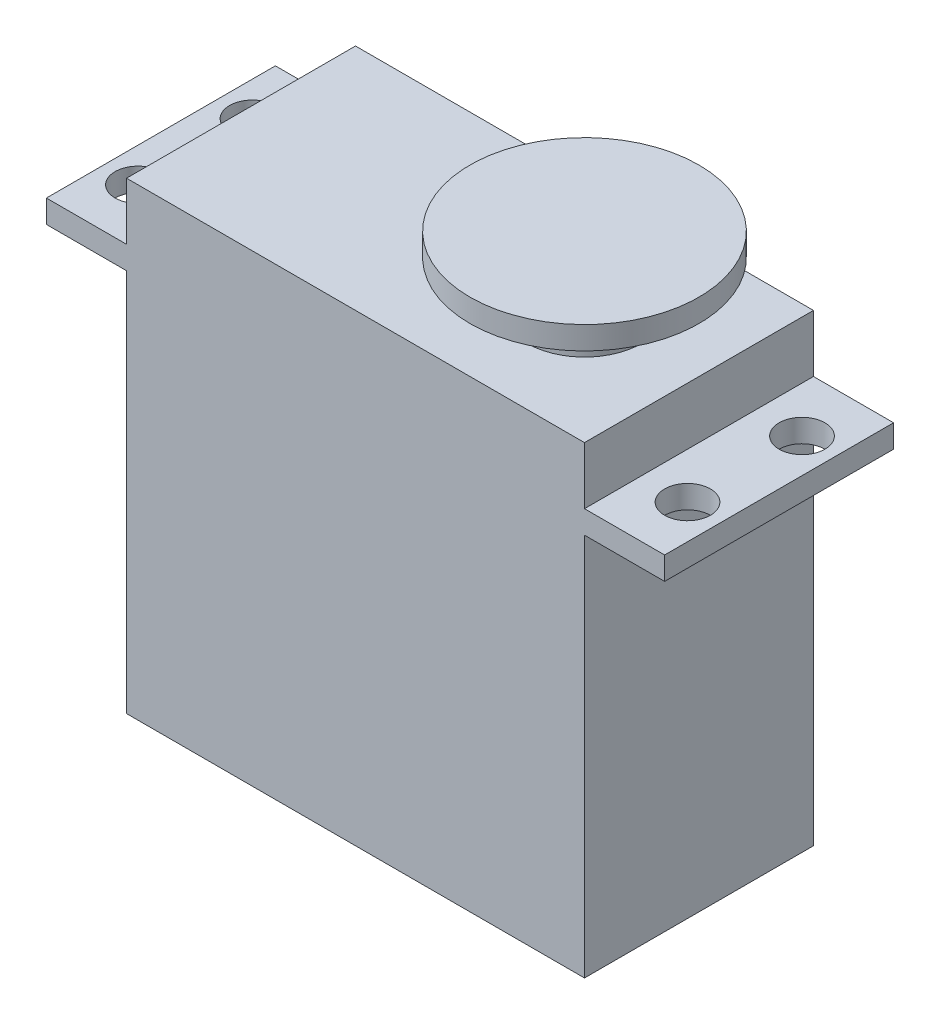
ISO-10303-21;
HEADER;
FILE_DESCRIPTION(('STEP AP214'),'2;1');
FILE_NAME('part.step','',(''),(''),'','','');
FILE_SCHEMA(('AUTOMOTIVE_DESIGN { 1 0 10303 214 1 1 1 1 }'));
ENDSEC;
DATA;
#1=APPLICATION_CONTEXT('core data for automotive mechanical design processes');
#2=APPLICATION_PROTOCOL_DEFINITION('international standard','automotive_design',2000,#1);
#3=PRODUCT_CONTEXT('',#1,'mechanical');
#4=PRODUCT('Part','Part','',(#3));
#5=PRODUCT_RELATED_PRODUCT_CATEGORY('part','',(#4));
#6=PRODUCT_DEFINITION_FORMATION('','',#4);
#7=PRODUCT_DEFINITION_CONTEXT('part definition',#1,'design');
#8=PRODUCT_DEFINITION('design','',#6,#7);
#9=PRODUCT_DEFINITION_SHAPE('','',#8);
#10=(LENGTH_UNIT() NAMED_UNIT(*) SI_UNIT(.MILLI.,.METRE.));
#11=(NAMED_UNIT(*) PLANE_ANGLE_UNIT() SI_UNIT($,.RADIAN.));
#12=(NAMED_UNIT(*) SI_UNIT($,.STERADIAN.) SOLID_ANGLE_UNIT());
#13=UNCERTAINTY_MEASURE_WITH_UNIT(LENGTH_MEASURE(1.E-05),#10,'distance_accuracy_value','');
#14=(GEOMETRIC_REPRESENTATION_CONTEXT(3) GLOBAL_UNCERTAINTY_ASSIGNED_CONTEXT((#13)) GLOBAL_UNIT_ASSIGNED_CONTEXT((#10,
#11,#12)) REPRESENTATION_CONTEXT('',''));
#15=CARTESIAN_POINT('',(0.,0.,0.));
#16=DIRECTION('',(0.,0.,1.));
#17=DIRECTION('',(1.,0.,0.));
#18=AXIS2_PLACEMENT_3D('',#15,#16,#17);
#19=CARTESIAN_POINT('',(47.,33.5,20.));
#20=DIRECTION('',(0.,-1.,0.));
#21=DIRECTION('',(0.,0.,-1.));
#22=AXIS2_PLACEMENT_3D('',#19,#20,#21);
#23=PLANE('',#22);
#24=CARTESIAN_POINT('',(44.,33.5,15.));
#25=DIRECTION('',(0.,1.,0.));
#26=DIRECTION('',(0.,0.,1.));
#27=AXIS2_PLACEMENT_3D('',#24,#25,#26);
#28=CIRCLE('',#27,2.);
#29=CARTESIAN_POINT('',(44.,33.5,17.));
#30=VERTEX_POINT('',#29);
#31=EDGE_CURVE('E159',#30,#30,#28,.T.);
#32=ORIENTED_EDGE('',*,*,#31,.T.);
#33=EDGE_LOOP('',(#32));
#34=FACE_BOUND('',#33,.T.);
#35=DIRECTION('',(0.,0.,1.));
#36=VECTOR('',#35,1.);
#37=CARTESIAN_POINT('',(40.,33.5,20.));
#38=LINE('',#37,#36);
#39=CARTESIAN_POINT('',(40.,33.5,0.));
#40=VERTEX_POINT('',#39);
#41=CARTESIAN_POINT('',(40.,33.5,20.));
#42=VERTEX_POINT('',#41);
#43=EDGE_CURVE('E157',#40,#42,#38,.T.);
#44=ORIENTED_EDGE('',*,*,#43,.F.);
#45=DIRECTION('',(-1.,0.,0.));
#46=VECTOR('',#45,1.);
#47=CARTESIAN_POINT('',(47.,33.5,0.));
#48=LINE('',#47,#46);
#49=CARTESIAN_POINT('',(47.,33.5,0.));
#50=VERTEX_POINT('',#49);
#51=EDGE_CURVE('E132',#50,#40,#48,.T.);
#52=ORIENTED_EDGE('',*,*,#51,.F.);
#53=DIRECTION('',(0.,0.,1.));
#54=VECTOR('',#53,1.);
#55=CARTESIAN_POINT('',(47.,33.5,20.));
#56=LINE('',#55,#54);
#57=CARTESIAN_POINT('',(47.,33.5,20.));
#58=VERTEX_POINT('',#57);
#59=EDGE_CURVE('E138',#50,#58,#56,.T.);
#60=ORIENTED_EDGE('',*,*,#59,.T.);
#61=DIRECTION('',(-1.,0.,0.));
#62=VECTOR('',#61,1.);
#63=CARTESIAN_POINT('',(47.,33.5,20.));
#64=LINE('',#63,#62);
#65=EDGE_CURVE('E49',#58,#42,#64,.T.);
#66=ORIENTED_EDGE('',*,*,#65,.T.);
#67=EDGE_LOOP('',(#44,#52,#60,#66));
#68=FACE_BOUND('',#67,.T.);
#69=CARTESIAN_POINT('',(44.,33.5,5.));
#70=DIRECTION('',(0.,1.,0.));
#71=DIRECTION('',(0.,0.,1.));
#72=AXIS2_PLACEMENT_3D('',#69,#70,#71);
#73=CIRCLE('',#72,2.);
#74=CARTESIAN_POINT('',(44.,33.5,7.));
#75=VERTEX_POINT('',#74);
#76=EDGE_CURVE('E536',#75,#75,#73,.T.);
#77=ORIENTED_EDGE('',*,*,#76,.T.);
#78=EDGE_LOOP('',(#77));
#79=FACE_BOUND('',#78,.T.);
#80=ADVANCED_FACE('F32',(#34,#68,#79),#23,.T.);
#81=CARTESIAN_POINT('',(47.,35.5,20.));
#82=DIRECTION('',(0.,1.,0.));
#83=DIRECTION('',(0.,0.,1.));
#84=AXIS2_PLACEMENT_3D('',#81,#82,#83);
#85=PLANE('',#84);
#86=CARTESIAN_POINT('',(44.,35.5,15.));
#87=DIRECTION('',(0.,-1.,0.));
#88=DIRECTION('',(0.,0.,1.));
#89=AXIS2_PLACEMENT_3D('',#86,#87,#88);
#90=CIRCLE('',#89,2.);
#91=CARTESIAN_POINT('',(44.,35.5,17.));
#92=VERTEX_POINT('',#91);
#93=EDGE_CURVE('E541',#92,#92,#90,.T.);
#94=ORIENTED_EDGE('',*,*,#93,.T.);
#95=EDGE_LOOP('',(#94));
#96=FACE_BOUND('',#95,.T.);
#97=DIRECTION('',(0.,0.,-1.));
#98=VECTOR('',#97,1.);
#99=CARTESIAN_POINT('',(40.,35.5,20.));
#100=LINE('',#99,#98);
#101=CARTESIAN_POINT('',(40.,35.5,20.));
#102=VERTEX_POINT('',#101);
#103=CARTESIAN_POINT('',(40.,35.5,0.));
#104=VERTEX_POINT('',#103);
#105=EDGE_CURVE('E142',#102,#104,#100,.T.);
#106=ORIENTED_EDGE('',*,*,#105,.F.);
#107=DIRECTION('',(-1.,0.,0.));
#108=VECTOR('',#107,1.);
#109=CARTESIAN_POINT('',(47.,35.5,20.));
#110=LINE('',#109,#108);
#111=CARTESIAN_POINT('',(47.,35.5,20.));
#112=VERTEX_POINT('',#111);
#113=EDGE_CURVE('E151',#112,#102,#110,.T.);
#114=ORIENTED_EDGE('',*,*,#113,.F.);
#115=DIRECTION('',(0.,0.,-1.));
#116=VECTOR('',#115,1.);
#117=CARTESIAN_POINT('',(47.,35.5,20.));
#118=LINE('',#117,#116);
#119=CARTESIAN_POINT('',(47.,35.5,0.));
#120=VERTEX_POINT('',#119);
#121=EDGE_CURVE('E141',#112,#120,#118,.T.);
#122=ORIENTED_EDGE('',*,*,#121,.T.);
#123=DIRECTION('',(-1.,0.,0.));
#124=VECTOR('',#123,1.);
#125=CARTESIAN_POINT('',(47.,35.5,0.));
#126=LINE('',#125,#124);
#127=EDGE_CURVE('E167',#120,#104,#126,.T.);
#128=ORIENTED_EDGE('',*,*,#127,.T.);
#129=EDGE_LOOP('',(#106,#114,#122,#128));
#130=FACE_BOUND('',#129,.T.);
#131=CARTESIAN_POINT('',(44.,35.5,5.));
#132=DIRECTION('',(0.,-1.,0.));
#133=DIRECTION('',(0.,0.,1.));
#134=AXIS2_PLACEMENT_3D('',#131,#132,#133);
#135=CIRCLE('',#134,2.);
#136=CARTESIAN_POINT('',(44.,35.5,7.));
#137=VERTEX_POINT('',#136);
#138=EDGE_CURVE('E539',#137,#137,#135,.T.);
#139=ORIENTED_EDGE('',*,*,#138,.T.);
#140=EDGE_LOOP('',(#139));
#141=FACE_BOUND('',#140,.T.);
#142=ADVANCED_FACE('F178',(#96,#130,#141),#85,.T.);
#143=CARTESIAN_POINT('',(40.,0.,20.));
#144=DIRECTION('',(-1.,0.,0.));
#145=DIRECTION('',(0.,0.,1.));
#146=AXIS2_PLACEMENT_3D('',#143,#144,#145);
#147=PLANE('',#146);
#148=DIRECTION('',(0.,1.,0.));
#149=VECTOR('',#148,1.);
#150=CARTESIAN_POINT('',(40.,0.,20.));
#151=LINE('',#150,#149);
#152=CARTESIAN_POINT('',(40.,40.5,20.));
#153=VERTEX_POINT('',#152);
#154=EDGE_CURVE('E160',#102,#153,#151,.T.);
#155=ORIENTED_EDGE('',*,*,#154,.F.);
#156=ORIENTED_EDGE('',*,*,#105,.T.);
#157=DIRECTION('',(0.,1.,0.));
#158=VECTOR('',#157,1.);
#159=CARTESIAN_POINT('',(40.,0.,0.));
#160=LINE('',#159,#158);
#161=CARTESIAN_POINT('',(40.,40.5,0.));
#162=VERTEX_POINT('',#161);
#163=EDGE_CURVE('E201',#104,#162,#160,.T.);
#164=ORIENTED_EDGE('',*,*,#163,.T.);
#165=DIRECTION('',(0.,0.,-1.));
#166=VECTOR('',#165,1.);
#167=CARTESIAN_POINT('',(40.,40.5,20.));
#168=LINE('',#167,#166);
#169=EDGE_CURVE('E184',#153,#162,#168,.T.);
#170=ORIENTED_EDGE('',*,*,#169,.F.);
#171=EDGE_LOOP('',(#155,#156,#164,#170));
#172=FACE_BOUND('',#171,.T.);
#173=ADVANCED_FACE('F182',(#172),#147,.F.);
#174=CARTESIAN_POINT('',(0.,0.,20.));
#175=DIRECTION('',(1.,0.,0.));
#176=DIRECTION('',(0.,0.,-1.));
#177=AXIS2_PLACEMENT_3D('',#174,#175,#176);
#178=PLANE('',#177);
#179=DIRECTION('',(0.,0.,1.));
#180=VECTOR('',#179,1.);
#181=CARTESIAN_POINT('',(0.,33.5,20.));
#182=LINE('',#181,#180);
#183=CARTESIAN_POINT('',(0.,33.5,0.));
#184=VERTEX_POINT('',#183);
#185=CARTESIAN_POINT('',(0.,33.5,20.));
#186=VERTEX_POINT('',#185);
#187=EDGE_CURVE('E231',#184,#186,#182,.T.);
#188=ORIENTED_EDGE('',*,*,#187,.F.);
#189=DIRECTION('',(0.,-1.,0.));
#190=VECTOR('',#189,1.);
#191=CARTESIAN_POINT('',(0.,0.,0.));
#192=LINE('',#191,#190);
#193=CARTESIAN_POINT('',(0.,0.,0.));
#194=VERTEX_POINT('',#193);
#195=EDGE_CURVE('E221',#184,#194,#192,.T.);
#196=ORIENTED_EDGE('',*,*,#195,.T.);
#197=DIRECTION('',(0.,0.,-1.));
#198=VECTOR('',#197,1.);
#199=CARTESIAN_POINT('',(0.,0.,20.));
#200=LINE('',#199,#198);
#201=CARTESIAN_POINT('',(0.,0.,20.));
#202=VERTEX_POINT('',#201);
#203=EDGE_CURVE('E11',#202,#194,#200,.T.);
#204=ORIENTED_EDGE('',*,*,#203,.F.);
#205=DIRECTION('',(0.,-1.,0.));
#206=VECTOR('',#205,1.);
#207=CARTESIAN_POINT('',(0.,0.,20.));
#208=LINE('',#207,#206);
#209=EDGE_CURVE('E57',#186,#202,#208,.T.);
#210=ORIENTED_EDGE('',*,*,#209,.F.);
#211=EDGE_LOOP('',(#188,#196,#204,#210));
#212=FACE_BOUND('',#211,.T.);
#213=ADVANCED_FACE('F34',(#212),#178,.F.);
#214=DIRECTION('',(0.,0.,-1.));
#215=VECTOR('',#214,1.);
#216=CARTESIAN_POINT('',(0.,35.5,20.));
#217=LINE('',#216,#215);
#218=CARTESIAN_POINT('',(0.,35.5,20.));
#219=VERTEX_POINT('',#218);
#220=CARTESIAN_POINT('',(0.,35.5,0.));
#221=VERTEX_POINT('',#220);
#222=EDGE_CURVE('E227',#219,#221,#217,.T.);
#223=ORIENTED_EDGE('',*,*,#222,.F.);
#224=CARTESIAN_POINT('',(0.,40.5,20.));
#225=VERTEX_POINT('',#224);
#226=EDGE_CURVE('E188',#225,#219,#208,.T.);
#227=ORIENTED_EDGE('',*,*,#226,.F.);
#228=DIRECTION('',(0.,0.,-1.));
#229=VECTOR('',#228,1.);
#230=CARTESIAN_POINT('',(0.,40.5,20.));
#231=LINE('',#230,#229);
#232=CARTESIAN_POINT('',(0.,40.5,0.));
#233=VERTEX_POINT('',#232);
#234=EDGE_CURVE('E213',#225,#233,#231,.T.);
#235=ORIENTED_EDGE('',*,*,#234,.T.);
#236=EDGE_CURVE('E219',#233,#221,#192,.T.);
#237=ORIENTED_EDGE('',*,*,#236,.T.);
#238=EDGE_LOOP('',(#223,#227,#235,#237));
#239=FACE_BOUND('',#238,.T.);
#240=ADVANCED_FACE('F348',(#239),#178,.F.);
#241=CARTESIAN_POINT('',(0.,40.5,20.));
#242=DIRECTION('',(0.,-1.,0.));
#243=DIRECTION('',(0.,0.,-1.));
#244=AXIS2_PLACEMENT_3D('',#241,#242,#243);
#245=PLANE('',#244);
#246=ORIENTED_EDGE('',*,*,#234,.F.);
#247=DIRECTION('',(-1.,0.,0.));
#248=VECTOR('',#247,1.);
#249=CARTESIAN_POINT('',(0.,40.5,20.));
#250=LINE('',#249,#248);
#251=EDGE_CURVE('E187',#153,#225,#250,.T.);
#252=ORIENTED_EDGE('',*,*,#251,.F.);
#253=ORIENTED_EDGE('',*,*,#169,.T.);
#254=DIRECTION('',(-1.,0.,0.));
#255=VECTOR('',#254,1.);
#256=CARTESIAN_POINT('',(0.,40.5,0.));
#257=LINE('',#256,#255);
#258=EDGE_CURVE('E210',#162,#233,#257,.T.);
#259=ORIENTED_EDGE('',*,*,#258,.T.);
#260=EDGE_LOOP('',(#246,#252,#253,#259));
#261=FACE_BOUND('',#260,.T.);
#262=CARTESIAN_POINT('',(30.,40.5,10.));
#263=DIRECTION('',(0.,1.,0.));
#264=DIRECTION('',(0.,0.,1.));
#265=AXIS2_PLACEMENT_3D('',#262,#263,#264);
#266=CIRCLE('',#265,5.);
#267=CARTESIAN_POINT('',(30.,40.5,15.));
#268=VERTEX_POINT('',#267);
#269=EDGE_CURVE('E268',#268,#268,#266,.T.);
#270=ORIENTED_EDGE('',*,*,#269,.F.);
#271=EDGE_LOOP('',(#270));
#272=FACE_BOUND('',#271,.T.);
#273=ADVANCED_FACE('F344',(#261,#272),#245,.F.);
#274=CARTESIAN_POINT('',(0.,0.,20.));
#275=DIRECTION('',(0.,1.,0.));
#276=DIRECTION('',(0.,0.,1.));
#277=AXIS2_PLACEMENT_3D('',#274,#275,#276);
#278=PLANE('',#277);
#279=DIRECTION('',(1.,0.,0.));
#280=VECTOR('',#279,1.);
#281=CARTESIAN_POINT('',(0.,0.,0.));
#282=LINE('',#281,#280);
#283=CARTESIAN_POINT('',(40.,0.,0.));
#284=VERTEX_POINT('',#283);
#285=EDGE_CURVE('E205',#194,#284,#282,.T.);
#286=ORIENTED_EDGE('',*,*,#285,.T.);
#287=DIRECTION('',(0.,0.,-1.));
#288=VECTOR('',#287,1.);
#289=CARTESIAN_POINT('',(40.,0.,20.));
#290=LINE('',#289,#288);
#291=CARTESIAN_POINT('',(40.,0.,20.));
#292=VERTEX_POINT('',#291);
#293=EDGE_CURVE('E41',#292,#284,#290,.T.);
#294=ORIENTED_EDGE('',*,*,#293,.F.);
#295=DIRECTION('',(1.,0.,0.));
#296=VECTOR('',#295,1.);
#297=CARTESIAN_POINT('',(0.,0.,20.));
#298=LINE('',#297,#296);
#299=EDGE_CURVE('E186',#202,#292,#298,.T.);
#300=ORIENTED_EDGE('',*,*,#299,.F.);
#301=ORIENTED_EDGE('',*,*,#203,.T.);
#302=EDGE_LOOP('',(#286,#294,#300,#301));
#303=FACE_BOUND('',#302,.T.);
#304=ADVANCED_FACE('F347',(#303),#278,.F.);
#305=EDGE_CURVE('E204',#284,#40,#160,.T.);
#306=ORIENTED_EDGE('',*,*,#305,.T.);
#307=ORIENTED_EDGE('',*,*,#43,.T.);
#308=EDGE_CURVE('E130',#292,#42,#151,.T.);
#309=ORIENTED_EDGE('',*,*,#308,.F.);
#310=ORIENTED_EDGE('',*,*,#293,.T.);
#311=EDGE_LOOP('',(#306,#307,#309,#310));
#312=FACE_BOUND('',#311,.T.);
#313=ADVANCED_FACE('F342',(#312),#147,.F.);
#314=CARTESIAN_POINT('',(0.,0.,20.));
#315=DIRECTION('',(0.,0.,-1.));
#316=DIRECTION('',(-1.,0.,0.));
#317=AXIS2_PLACEMENT_3D('',#314,#315,#316);
#318=PLANE('',#317);
#319=ORIENTED_EDGE('',*,*,#226,.T.);
#320=DIRECTION('',(1.,0.,0.));
#321=VECTOR('',#320,1.);
#322=CARTESIAN_POINT('',(-7.,35.5,20.));
#323=LINE('',#322,#321);
#324=CARTESIAN_POINT('',(-7.,35.5,20.));
#325=VERTEX_POINT('',#324);
#326=EDGE_CURVE('E262',#325,#219,#323,.T.);
#327=ORIENTED_EDGE('',*,*,#326,.F.);
#328=DIRECTION('',(0.,1.,0.));
#329=VECTOR('',#328,1.);
#330=CARTESIAN_POINT('',(-7.,35.5,20.));
#331=LINE('',#330,#329);
#332=CARTESIAN_POINT('',(-7.,33.5,20.));
#333=VERTEX_POINT('',#332);
#334=EDGE_CURVE('E247',#333,#325,#331,.T.);
#335=ORIENTED_EDGE('',*,*,#334,.F.);
#336=DIRECTION('',(1.,0.,0.));
#337=VECTOR('',#336,1.);
#338=CARTESIAN_POINT('',(-7.,33.5,20.));
#339=LINE('',#338,#337);
#340=EDGE_CURVE('E250',#333,#186,#339,.T.);
#341=ORIENTED_EDGE('',*,*,#340,.T.);
#342=ORIENTED_EDGE('',*,*,#209,.T.);
#343=ORIENTED_EDGE('',*,*,#299,.T.);
#344=ORIENTED_EDGE('',*,*,#308,.T.);
#345=ORIENTED_EDGE('',*,*,#65,.F.);
#346=DIRECTION('',(0.,1.,0.));
#347=VECTOR('',#346,1.);
#348=CARTESIAN_POINT('',(47.,35.5,20.));
#349=LINE('',#348,#347);
#350=EDGE_CURVE('E127',#58,#112,#349,.T.);
#351=ORIENTED_EDGE('',*,*,#350,.T.);
#352=ORIENTED_EDGE('',*,*,#113,.T.);
#353=ORIENTED_EDGE('',*,*,#154,.T.);
#354=ORIENTED_EDGE('',*,*,#251,.T.);
#355=EDGE_LOOP('',(#319,#327,#335,#341,#342,#343,#344,#345,#351,#352,#353,#354));
#356=FACE_BOUND('',#355,.T.);
#357=ADVANCED_FACE('F126',(#356),#318,.F.);
#358=CARTESIAN_POINT('',(0.,0.,0.));
#359=DIRECTION('',(0.,0.,-1.));
#360=DIRECTION('',(-1.,0.,0.));
#361=AXIS2_PLACEMENT_3D('',#358,#359,#360);
#362=PLANE('',#361);
#363=ORIENTED_EDGE('',*,*,#236,.F.);
#364=ORIENTED_EDGE('',*,*,#258,.F.);
#365=ORIENTED_EDGE('',*,*,#163,.F.);
#366=ORIENTED_EDGE('',*,*,#127,.F.);
#367=DIRECTION('',(0.,-1.,0.));
#368=VECTOR('',#367,1.);
#369=CARTESIAN_POINT('',(47.,35.5,0.));
#370=LINE('',#369,#368);
#371=EDGE_CURVE('E145',#120,#50,#370,.T.);
#372=ORIENTED_EDGE('',*,*,#371,.T.);
#373=ORIENTED_EDGE('',*,*,#51,.T.);
#374=ORIENTED_EDGE('',*,*,#305,.F.);
#375=ORIENTED_EDGE('',*,*,#285,.F.);
#376=ORIENTED_EDGE('',*,*,#195,.F.);
#377=DIRECTION('',(1.,0.,0.));
#378=VECTOR('',#377,1.);
#379=CARTESIAN_POINT('',(-7.,33.5,0.));
#380=LINE('',#379,#378);
#381=CARTESIAN_POINT('',(-7.,33.5,0.));
#382=VERTEX_POINT('',#381);
#383=EDGE_CURVE('E253',#382,#184,#380,.T.);
#384=ORIENTED_EDGE('',*,*,#383,.F.);
#385=DIRECTION('',(0.,-1.,0.));
#386=VECTOR('',#385,1.);
#387=CARTESIAN_POINT('',(-7.,35.5,0.));
#388=LINE('',#387,#386);
#389=CARTESIAN_POINT('',(-7.,35.5,0.));
#390=VERTEX_POINT('',#389);
#391=EDGE_CURVE('E368',#390,#382,#388,.T.);
#392=ORIENTED_EDGE('',*,*,#391,.F.);
#393=DIRECTION('',(1.,0.,0.));
#394=VECTOR('',#393,1.);
#395=CARTESIAN_POINT('',(-7.,35.5,0.));
#396=LINE('',#395,#394);
#397=EDGE_CURVE('E233',#390,#221,#396,.T.);
#398=ORIENTED_EDGE('',*,*,#397,.T.);
#399=EDGE_LOOP('',(#363,#364,#365,#366,#372,#373,#374,#375,#376,#384,#392,#398));
#400=FACE_BOUND('',#399,.T.);
#401=ADVANCED_FACE('F330',(#400),#362,.T.);
#402=CARTESIAN_POINT('',(30.,44.5,10.));
#403=DIRECTION('',(0.,1.,0.));
#404=DIRECTION('',(0.,0.,1.));
#405=AXIS2_PLACEMENT_3D('',#402,#403,#404);
#406=PLANE('',#405);
#407=CARTESIAN_POINT('',(30.,44.5,10.));
#408=DIRECTION('',(0.,1.,0.));
#409=DIRECTION('',(0.,0.,1.));
#410=AXIS2_PLACEMENT_3D('',#407,#408,#409);
#411=CIRCLE('',#410,10.);
#412=CARTESIAN_POINT('',(30.,44.5,20.));
#413=VERTEX_POINT('',#412);
#414=EDGE_CURVE('E276',#413,#413,#411,.T.);
#415=ORIENTED_EDGE('',*,*,#414,.F.);
#416=EDGE_LOOP('',(#415));
#417=FACE_BOUND('',#416,.T.);
#418=CARTESIAN_POINT('',(30.,44.5,10.));
#419=DIRECTION('',(0.,1.,0.));
#420=DIRECTION('',(0.,0.,1.));
#421=AXIS2_PLACEMENT_3D('',#418,#419,#420);
#422=CIRCLE('',#421,5.);
#423=CARTESIAN_POINT('',(30.,44.5,15.));
#424=VERTEX_POINT('',#423);
#425=EDGE_CURVE('E242',#424,#424,#422,.T.);
#426=ORIENTED_EDGE('',*,*,#425,.T.);
#427=EDGE_LOOP('',(#426));
#428=FACE_BOUND('',#427,.T.);
#429=ADVANCED_FACE('F327',(#417,#428),#406,.F.);
#430=CARTESIAN_POINT('',(30.,44.5,10.));
#431=DIRECTION('',(0.,-1.,0.));
#432=DIRECTION('',(0.,0.,-1.));
#433=AXIS2_PLACEMENT_3D('',#430,#431,#432);
#434=CYLINDRICAL_SURFACE('',#433,5.);
#435=ORIENTED_EDGE('',*,*,#425,.F.);
#436=EDGE_LOOP('',(#435));
#437=FACE_BOUND('',#436,.T.);
#438=ORIENTED_EDGE('',*,*,#269,.T.);
#439=EDGE_LOOP('',(#438));
#440=FACE_BOUND('',#439,.T.);
#441=ADVANCED_FACE('F296',(#437,#440),#434,.T.);
#442=CARTESIAN_POINT('',(30.,46.5,10.));
#443=DIRECTION('',(0.,1.,0.));
#444=DIRECTION('',(0.,0.,1.));
#445=AXIS2_PLACEMENT_3D('',#442,#443,#444);
#446=PLANE('',#445);
#447=CARTESIAN_POINT('',(30.,46.5,10.));
#448=DIRECTION('',(0.,1.,0.));
#449=DIRECTION('',(0.,0.,1.));
#450=AXIS2_PLACEMENT_3D('',#447,#448,#449);
#451=CIRCLE('',#450,10.);
#452=CARTESIAN_POINT('',(30.,46.5,20.));
#453=VERTEX_POINT('',#452);
#454=EDGE_CURVE('E224',#453,#453,#451,.T.);
#455=ORIENTED_EDGE('',*,*,#454,.T.);
#456=EDGE_LOOP('',(#455));
#457=FACE_BOUND('',#456,.T.);
#458=ADVANCED_FACE('F282',(#457),#446,.T.);
#459=CARTESIAN_POINT('',(30.,46.5,10.));
#460=DIRECTION('',(0.,-1.,0.));
#461=DIRECTION('',(0.,0.,-1.));
#462=AXIS2_PLACEMENT_3D('',#459,#460,#461);
#463=CYLINDRICAL_SURFACE('',#462,10.);
#464=ORIENTED_EDGE('',*,*,#414,.T.);
#465=EDGE_LOOP('',(#464));
#466=FACE_BOUND('',#465,.T.);
#467=ORIENTED_EDGE('',*,*,#454,.F.);
#468=EDGE_LOOP('',(#467));
#469=FACE_BOUND('',#468,.T.);
#470=ADVANCED_FACE('F284',(#466,#469),#463,.T.);
#471=CARTESIAN_POINT('',(-7.,35.5,20.));
#472=DIRECTION('',(0.,-1.,0.));
#473=DIRECTION('',(0.,0.,-1.));
#474=AXIS2_PLACEMENT_3D('',#471,#472,#473);
#475=PLANE('',#474);
#476=CARTESIAN_POINT('',(-4.,35.5,5.));
#477=DIRECTION('',(0.,1.,0.));
#478=DIRECTION('',(0.,0.,1.));
#479=AXIS2_PLACEMENT_3D('',#476,#477,#478);
#480=CIRCLE('',#479,2.);
#481=CARTESIAN_POINT('',(-4.,35.5,7.));
#482=VERTEX_POINT('',#481);
#483=EDGE_CURVE('E131',#482,#482,#480,.T.);
#484=ORIENTED_EDGE('',*,*,#483,.F.);
#485=EDGE_LOOP('',(#484));
#486=FACE_BOUND('',#485,.T.);
#487=CARTESIAN_POINT('',(-4.,35.5,15.));
#488=DIRECTION('',(0.,1.,0.));
#489=DIRECTION('',(0.,0.,1.));
#490=AXIS2_PLACEMENT_3D('',#487,#488,#489);
#491=CIRCLE('',#490,2.);
#492=CARTESIAN_POINT('',(-4.,35.5,17.));
#493=VERTEX_POINT('',#492);
#494=EDGE_CURVE('E374',#493,#493,#491,.T.);
#495=ORIENTED_EDGE('',*,*,#494,.F.);
#496=EDGE_LOOP('',(#495));
#497=FACE_BOUND('',#496,.T.);
#498=ORIENTED_EDGE('',*,*,#222,.T.);
#499=ORIENTED_EDGE('',*,*,#397,.F.);
#500=DIRECTION('',(0.,0.,-1.));
#501=VECTOR('',#500,1.);
#502=CARTESIAN_POINT('',(-7.,35.5,20.));
#503=LINE('',#502,#501);
#504=EDGE_CURVE('E366',#325,#390,#503,.T.);
#505=ORIENTED_EDGE('',*,*,#504,.F.);
#506=ORIENTED_EDGE('',*,*,#326,.T.);
#507=EDGE_LOOP('',(#498,#499,#505,#506));
#508=FACE_BOUND('',#507,.T.);
#509=ADVANCED_FACE('F286',(#486,#497,#508),#475,.F.);
#510=CARTESIAN_POINT('',(-7.,33.5,20.));
#511=DIRECTION('',(0.,1.,0.));
#512=DIRECTION('',(0.,0.,1.));
#513=AXIS2_PLACEMENT_3D('',#510,#511,#512);
#514=PLANE('',#513);
#515=CARTESIAN_POINT('',(-4.,33.5,5.));
#516=DIRECTION('',(0.,1.,0.));
#517=DIRECTION('',(0.,0.,1.));
#518=AXIS2_PLACEMENT_3D('',#515,#516,#517);
#519=CIRCLE('',#518,2.);
#520=CARTESIAN_POINT('',(-4.,33.5,7.));
#521=VERTEX_POINT('',#520);
#522=EDGE_CURVE('E377',#521,#521,#519,.F.);
#523=ORIENTED_EDGE('',*,*,#522,.F.);
#524=EDGE_LOOP('',(#523));
#525=FACE_BOUND('',#524,.T.);
#526=CARTESIAN_POINT('',(-4.,33.5,15.));
#527=DIRECTION('',(0.,1.,0.));
#528=DIRECTION('',(0.,0.,1.));
#529=AXIS2_PLACEMENT_3D('',#526,#527,#528);
#530=CIRCLE('',#529,2.);
#531=CARTESIAN_POINT('',(-4.,33.5,17.));
#532=VERTEX_POINT('',#531);
#533=EDGE_CURVE('E232',#532,#532,#530,.F.);
#534=ORIENTED_EDGE('',*,*,#533,.F.);
#535=EDGE_LOOP('',(#534));
#536=FACE_BOUND('',#535,.T.);
#537=ORIENTED_EDGE('',*,*,#187,.T.);
#538=ORIENTED_EDGE('',*,*,#340,.F.);
#539=DIRECTION('',(0.,0.,1.));
#540=VECTOR('',#539,1.);
#541=CARTESIAN_POINT('',(-7.,33.5,20.));
#542=LINE('',#541,#540);
#543=EDGE_CURVE('E238',#382,#333,#542,.T.);
#544=ORIENTED_EDGE('',*,*,#543,.F.);
#545=ORIENTED_EDGE('',*,*,#383,.T.);
#546=EDGE_LOOP('',(#537,#538,#544,#545));
#547=FACE_BOUND('',#546,.T.);
#548=ADVANCED_FACE('F293',(#525,#536,#547),#514,.F.);
#549=CARTESIAN_POINT('',(-7.,0.,0.));
#550=DIRECTION('',(1.,0.,0.));
#551=DIRECTION('',(0.,0.,-1.));
#552=AXIS2_PLACEMENT_3D('',#549,#550,#551);
#553=PLANE('',#552);
#554=ORIENTED_EDGE('',*,*,#334,.T.);
#555=ORIENTED_EDGE('',*,*,#504,.T.);
#556=ORIENTED_EDGE('',*,*,#391,.T.);
#557=ORIENTED_EDGE('',*,*,#543,.T.);
#558=EDGE_LOOP('',(#554,#555,#556,#557));
#559=FACE_BOUND('',#558,.T.);
#560=ADVANCED_FACE('F317',(#559),#553,.F.);
#561=CARTESIAN_POINT('',(-4.,27.8431457505076,15.));
#562=DIRECTION('',(0.,1.,0.));
#563=DIRECTION('',(0.,0.,1.));
#564=AXIS2_PLACEMENT_3D('',#561,#562,#563);
#565=CYLINDRICAL_SURFACE('',#564,2.);
#566=CARTESIAN_POINT('',(-4.,33.5,17.));
#567=CARTESIAN_POINT('',(-4.,33.5208333333333,17.));
#568=CARTESIAN_POINT('',(-4.,33.5416666666667,17.));
#569=CARTESIAN_POINT('',(-4.,33.5833333333333,17.));
#570=CARTESIAN_POINT('',(-4.,33.6041666666667,17.));
#571=CARTESIAN_POINT('',(-4.,33.6458333333333,17.));
#572=CARTESIAN_POINT('',(-4.,33.6666666666667,17.));
#573=CARTESIAN_POINT('',(-4.,33.7083333333333,17.));
#574=CARTESIAN_POINT('',(-4.,33.7291666666667,17.));
#575=CARTESIAN_POINT('',(-4.,33.7708333333333,17.));
#576=CARTESIAN_POINT('',(-4.,33.7916666666667,17.));
#577=CARTESIAN_POINT('',(-4.,33.8333333333333,17.));
#578=CARTESIAN_POINT('',(-4.,33.8541666666667,17.));
#579=CARTESIAN_POINT('',(-4.,33.8958333333333,17.));
#580=CARTESIAN_POINT('',(-4.,33.9166666666667,17.));
#581=CARTESIAN_POINT('',(-4.,33.9583333333333,17.));
#582=CARTESIAN_POINT('',(-4.,33.9791666666667,17.));
#583=CARTESIAN_POINT('',(-4.,34.0208333333333,17.));
#584=CARTESIAN_POINT('',(-4.,34.0416666666667,17.));
#585=CARTESIAN_POINT('',(-4.,34.0833333333333,17.));
#586=CARTESIAN_POINT('',(-4.,34.1041666666667,17.));
#587=CARTESIAN_POINT('',(-4.,34.1458333333333,17.));
#588=CARTESIAN_POINT('',(-4.,34.1666666666667,17.));
#589=CARTESIAN_POINT('',(-4.,34.2083333333333,17.));
#590=CARTESIAN_POINT('',(-4.,34.2291666666667,17.));
#591=CARTESIAN_POINT('',(-4.,34.2708333333333,17.));
#592=CARTESIAN_POINT('',(-4.,34.2916666666667,17.));
#593=CARTESIAN_POINT('',(-4.,34.3333333333333,17.));
#594=CARTESIAN_POINT('',(-4.,34.3541666666667,17.));
#595=CARTESIAN_POINT('',(-4.,34.3958333333333,17.));
#596=CARTESIAN_POINT('',(-4.,34.4166666666667,17.));
#597=CARTESIAN_POINT('',(-4.,34.4583333333333,17.));
#598=CARTESIAN_POINT('',(-4.,34.4791666666667,17.));
#599=CARTESIAN_POINT('',(-4.,34.5208333333333,17.));
#600=CARTESIAN_POINT('',(-4.,34.5416666666667,17.));
#601=CARTESIAN_POINT('',(-4.,34.5833333333333,17.));
#602=CARTESIAN_POINT('',(-4.,34.6041666666667,17.));
#603=CARTESIAN_POINT('',(-4.,34.6458333333333,17.));
#604=CARTESIAN_POINT('',(-4.,34.6666666666667,17.));
#605=CARTESIAN_POINT('',(-4.,34.7083333333333,17.));
#606=CARTESIAN_POINT('',(-4.,34.7291666666667,17.));
#607=CARTESIAN_POINT('',(-4.,34.7708333333333,17.));
#608=CARTESIAN_POINT('',(-4.,34.7916666666667,17.));
#609=CARTESIAN_POINT('',(-4.,34.8333333333333,17.));
#610=CARTESIAN_POINT('',(-4.,34.8541666666667,17.));
#611=CARTESIAN_POINT('',(-4.,34.8958333333333,17.));
#612=CARTESIAN_POINT('',(-4.,34.9166666666667,17.));
#613=CARTESIAN_POINT('',(-4.,34.9583333333333,17.));
#614=CARTESIAN_POINT('',(-4.,34.9791666666667,17.));
#615=CARTESIAN_POINT('',(-4.,35.0208333333333,17.));
#616=CARTESIAN_POINT('',(-4.,35.0416666666667,17.));
#617=CARTESIAN_POINT('',(-4.,35.0833333333333,17.));
#618=CARTESIAN_POINT('',(-4.,35.1041666666667,17.));
#619=CARTESIAN_POINT('',(-4.,35.1458333333333,17.));
#620=CARTESIAN_POINT('',(-4.,35.1666666666667,17.));
#621=CARTESIAN_POINT('',(-4.,35.2083333333333,17.));
#622=CARTESIAN_POINT('',(-4.,35.2291666666667,17.));
#623=CARTESIAN_POINT('',(-4.,35.2708333333333,17.));
#624=CARTESIAN_POINT('',(-4.,35.2916666666667,17.));
#625=CARTESIAN_POINT('',(-4.,35.3333333333333,17.));
#626=CARTESIAN_POINT('',(-4.,35.3541666666667,17.));
#627=CARTESIAN_POINT('',(-4.,35.3958333333333,17.));
#628=CARTESIAN_POINT('',(-4.,35.4166666666667,17.));
#629=CARTESIAN_POINT('',(-4.,35.4583333333333,17.));
#630=CARTESIAN_POINT('',(-4.,35.4791666666667,17.));
#631=CARTESIAN_POINT('',(-4.,35.5,17.));
#632=B_SPLINE_CURVE_WITH_KNOTS('',3,(#566,#567,#568,#569,#570,#571,#572,#573,#574,#575,#576,
#577,#578,#579,#580,#581,#582,#583,#584,#585,#586,#587,#588,#589,#590,#591,#592,#593,#594,#595,
#596,#597,#598,#599,#600,#601,#602,#603,#604,#605,#606,#607,#608,#609,#610,#611,#612,#613,#614,
#615,#616,#617,#618,#619,#620,#621,#622,#623,#624,#625,#626,#627,#628,#629,#630,#631),
.UNSPECIFIED.,.F.,.F.,(4,2,2,2,2,2,2,2,2,2,2,2,2,2,2,2,2,2,2,2,2,2,2,2,2,2,2,2,2,2,2,2,4),(0.,
0.0625000000000001,0.125,0.1875,0.25,0.3125,0.375,0.4375,0.5,0.5625,0.625000000000001,
0.687500000000001,0.750000000000001,0.812500000000001,0.875000000000001,0.937500000000001,1.,
1.0625,1.125,1.1875,1.25,1.3125,1.375,1.4375,1.5,1.5625,1.625,1.6875,1.75,1.8125,1.875,1.9375,
2.),.UNSPECIFIED.);
#633=EDGE_CURVE('BSEAM313',#532,#493,#632,.T.);
#634=ORIENTED_EDGE('',*,*,#533,.T.);
#635=ORIENTED_EDGE('',*,*,#494,.T.);
#636=ORIENTED_EDGE('',*,*,#633,.T.);
#637=ORIENTED_EDGE('',*,*,#633,.F.);
#638=EDGE_LOOP('',(#634,#636,#635,#637));
#639=FACE_BOUND('',#638,.T.);
#640=ADVANCED_FACE('F313',(#639),#565,.F.);
#641=CARTESIAN_POINT('',(-4.,27.8431457505076,5.));
#642=DIRECTION('',(0.,1.,0.));
#643=DIRECTION('',(0.,0.,1.));
#644=AXIS2_PLACEMENT_3D('',#641,#642,#643);
#645=CYLINDRICAL_SURFACE('',#644,2.);
#646=CARTESIAN_POINT('',(-4.,33.5,7.));
#647=CARTESIAN_POINT('',(-4.,33.5208333333333,7.));
#648=CARTESIAN_POINT('',(-4.,33.5416666666667,7.));
#649=CARTESIAN_POINT('',(-4.,33.5833333333333,7.));
#650=CARTESIAN_POINT('',(-4.,33.6041666666667,7.));
#651=CARTESIAN_POINT('',(-4.,33.6458333333333,7.));
#652=CARTESIAN_POINT('',(-4.,33.6666666666667,7.));
#653=CARTESIAN_POINT('',(-4.,33.7083333333333,7.));
#654=CARTESIAN_POINT('',(-4.,33.7291666666667,7.));
#655=CARTESIAN_POINT('',(-4.,33.7708333333333,7.));
#656=CARTESIAN_POINT('',(-4.,33.7916666666667,7.));
#657=CARTESIAN_POINT('',(-4.,33.8333333333333,7.));
#658=CARTESIAN_POINT('',(-4.,33.8541666666667,7.));
#659=CARTESIAN_POINT('',(-4.,33.8958333333333,7.));
#660=CARTESIAN_POINT('',(-4.,33.9166666666667,7.));
#661=CARTESIAN_POINT('',(-4.,33.9583333333333,7.));
#662=CARTESIAN_POINT('',(-4.,33.9791666666667,7.));
#663=CARTESIAN_POINT('',(-4.,34.0208333333333,7.));
#664=CARTESIAN_POINT('',(-4.,34.0416666666667,7.));
#665=CARTESIAN_POINT('',(-4.,34.0833333333333,7.));
#666=CARTESIAN_POINT('',(-4.,34.1041666666667,7.));
#667=CARTESIAN_POINT('',(-4.,34.1458333333333,7.));
#668=CARTESIAN_POINT('',(-4.,34.1666666666667,7.));
#669=CARTESIAN_POINT('',(-4.,34.2083333333333,7.));
#670=CARTESIAN_POINT('',(-4.,34.2291666666667,7.));
#671=CARTESIAN_POINT('',(-4.,34.2708333333333,7.));
#672=CARTESIAN_POINT('',(-4.,34.2916666666667,7.));
#673=CARTESIAN_POINT('',(-4.,34.3333333333333,7.));
#674=CARTESIAN_POINT('',(-4.,34.3541666666667,7.));
#675=CARTESIAN_POINT('',(-4.,34.3958333333333,7.));
#676=CARTESIAN_POINT('',(-4.,34.4166666666667,7.));
#677=CARTESIAN_POINT('',(-4.,34.4583333333333,7.));
#678=CARTESIAN_POINT('',(-4.,34.4791666666667,7.));
#679=CARTESIAN_POINT('',(-4.,34.5208333333333,7.));
#680=CARTESIAN_POINT('',(-4.,34.5416666666667,7.));
#681=CARTESIAN_POINT('',(-4.,34.5833333333333,7.));
#682=CARTESIAN_POINT('',(-4.,34.6041666666667,7.));
#683=CARTESIAN_POINT('',(-4.,34.6458333333333,7.));
#684=CARTESIAN_POINT('',(-4.,34.6666666666667,7.));
#685=CARTESIAN_POINT('',(-4.,34.7083333333333,7.));
#686=CARTESIAN_POINT('',(-4.,34.7291666666667,7.));
#687=CARTESIAN_POINT('',(-4.,34.7708333333333,7.));
#688=CARTESIAN_POINT('',(-4.,34.7916666666667,7.));
#689=CARTESIAN_POINT('',(-4.,34.8333333333333,7.));
#690=CARTESIAN_POINT('',(-4.,34.8541666666667,7.));
#691=CARTESIAN_POINT('',(-4.,34.8958333333333,7.));
#692=CARTESIAN_POINT('',(-4.,34.9166666666667,7.));
#693=CARTESIAN_POINT('',(-4.,34.9583333333333,7.));
#694=CARTESIAN_POINT('',(-4.,34.9791666666667,7.));
#695=CARTESIAN_POINT('',(-4.,35.0208333333333,7.));
#696=CARTESIAN_POINT('',(-4.,35.0416666666667,7.));
#697=CARTESIAN_POINT('',(-4.,35.0833333333333,7.));
#698=CARTESIAN_POINT('',(-4.,35.1041666666667,7.));
#699=CARTESIAN_POINT('',(-4.,35.1458333333333,7.));
#700=CARTESIAN_POINT('',(-4.,35.1666666666667,7.));
#701=CARTESIAN_POINT('',(-4.,35.2083333333333,7.));
#702=CARTESIAN_POINT('',(-4.,35.2291666666667,7.));
#703=CARTESIAN_POINT('',(-4.,35.2708333333333,7.));
#704=CARTESIAN_POINT('',(-4.,35.2916666666667,7.));
#705=CARTESIAN_POINT('',(-4.,35.3333333333333,7.));
#706=CARTESIAN_POINT('',(-4.,35.3541666666667,7.));
#707=CARTESIAN_POINT('',(-4.,35.3958333333333,7.));
#708=CARTESIAN_POINT('',(-4.,35.4166666666667,7.));
#709=CARTESIAN_POINT('',(-4.,35.4583333333333,7.));
#710=CARTESIAN_POINT('',(-4.,35.4791666666667,7.));
#711=CARTESIAN_POINT('',(-4.,35.5,7.));
#712=B_SPLINE_CURVE_WITH_KNOTS('',3,(#646,#647,#648,#649,#650,#651,#652,#653,#654,#655,#656,
#657,#658,#659,#660,#661,#662,#663,#664,#665,#666,#667,#668,#669,#670,#671,#672,#673,#674,#675,
#676,#677,#678,#679,#680,#681,#682,#683,#684,#685,#686,#687,#688,#689,#690,#691,#692,#693,#694,
#695,#696,#697,#698,#699,#700,#701,#702,#703,#704,#705,#706,#707,#708,#709,#710,#711),
.UNSPECIFIED.,.F.,.F.,(4,2,2,2,2,2,2,2,2,2,2,2,2,2,2,2,2,2,2,2,2,2,2,2,2,2,2,2,2,2,2,2,4),(0.,
0.0625000000000001,0.125,0.1875,0.25,0.3125,0.375,0.4375,0.5,0.5625,0.625000000000001,
0.687500000000001,0.750000000000001,0.812500000000001,0.875000000000001,0.937500000000001,1.,
1.0625,1.125,1.1875,1.25,1.3125,1.375,1.4375,1.5,1.5625,1.625,1.6875,1.75,1.8125,1.875,1.9375,
2.),.UNSPECIFIED.);
#713=EDGE_CURVE('BSEAM310',#521,#482,#712,.T.);
#714=ORIENTED_EDGE('',*,*,#522,.T.);
#715=ORIENTED_EDGE('',*,*,#483,.T.);
#716=ORIENTED_EDGE('',*,*,#713,.T.);
#717=ORIENTED_EDGE('',*,*,#713,.F.);
#718=EDGE_LOOP('',(#714,#716,#715,#717));
#719=FACE_BOUND('',#718,.T.);
#720=ADVANCED_FACE('F310',(#719),#645,.F.);
#721=CARTESIAN_POINT('',(47.,0.,0.));
#722=DIRECTION('',(-1.,0.,0.));
#723=DIRECTION('',(0.,0.,-1.));
#724=AXIS2_PLACEMENT_3D('',#721,#722,#723);
#725=PLANE('',#724);
#726=ORIENTED_EDGE('',*,*,#350,.F.);
#727=ORIENTED_EDGE('',*,*,#59,.F.);
#728=ORIENTED_EDGE('',*,*,#371,.F.);
#729=ORIENTED_EDGE('',*,*,#121,.F.);
#730=EDGE_LOOP('',(#726,#727,#728,#729));
#731=FACE_BOUND('',#730,.T.);
#732=ADVANCED_FACE('F136',(#731),#725,.F.);
#733=CARTESIAN_POINT('',(44.,27.8431457505076,15.));
#734=DIRECTION('',(0.,1.,0.));
#735=DIRECTION('',(0.,0.,1.));
#736=AXIS2_PLACEMENT_3D('',#733,#734,#735);
#737=CYLINDRICAL_SURFACE('',#736,2.);
#738=CARTESIAN_POINT('',(44.,33.5,17.));
#739=CARTESIAN_POINT('',(44.,33.5208333333333,17.));
#740=CARTESIAN_POINT('',(44.,33.5416666666667,17.));
#741=CARTESIAN_POINT('',(44.,33.5833333333333,17.));
#742=CARTESIAN_POINT('',(44.,33.6041666666667,17.));
#743=CARTESIAN_POINT('',(44.,33.6458333333333,17.));
#744=CARTESIAN_POINT('',(44.,33.6666666666667,17.));
#745=CARTESIAN_POINT('',(44.,33.7083333333333,17.));
#746=CARTESIAN_POINT('',(44.,33.7291666666667,17.));
#747=CARTESIAN_POINT('',(44.,33.7708333333333,17.));
#748=CARTESIAN_POINT('',(44.,33.7916666666667,17.));
#749=CARTESIAN_POINT('',(44.,33.8333333333333,17.));
#750=CARTESIAN_POINT('',(44.,33.8541666666667,17.));
#751=CARTESIAN_POINT('',(44.,33.8958333333333,17.));
#752=CARTESIAN_POINT('',(44.,33.9166666666667,17.));
#753=CARTESIAN_POINT('',(44.,33.9583333333333,17.));
#754=CARTESIAN_POINT('',(44.,33.9791666666667,17.));
#755=CARTESIAN_POINT('',(44.,34.0208333333333,17.));
#756=CARTESIAN_POINT('',(44.,34.0416666666667,17.));
#757=CARTESIAN_POINT('',(44.,34.0833333333333,17.));
#758=CARTESIAN_POINT('',(44.,34.1041666666667,17.));
#759=CARTESIAN_POINT('',(44.,34.1458333333333,17.));
#760=CARTESIAN_POINT('',(44.,34.1666666666667,17.));
#761=CARTESIAN_POINT('',(44.,34.2083333333333,17.));
#762=CARTESIAN_POINT('',(44.,34.2291666666667,17.));
#763=CARTESIAN_POINT('',(44.,34.2708333333333,17.));
#764=CARTESIAN_POINT('',(44.,34.2916666666667,17.));
#765=CARTESIAN_POINT('',(44.,34.3333333333333,17.));
#766=CARTESIAN_POINT('',(44.,34.3541666666667,17.));
#767=CARTESIAN_POINT('',(44.,34.3958333333333,17.));
#768=CARTESIAN_POINT('',(44.,34.4166666666667,17.));
#769=CARTESIAN_POINT('',(44.,34.4583333333333,17.));
#770=CARTESIAN_POINT('',(44.,34.4791666666667,17.));
#771=CARTESIAN_POINT('',(44.,34.5208333333333,17.));
#772=CARTESIAN_POINT('',(44.,34.5416666666667,17.));
#773=CARTESIAN_POINT('',(44.,34.5833333333333,17.));
#774=CARTESIAN_POINT('',(44.,34.6041666666667,17.));
#775=CARTESIAN_POINT('',(44.,34.6458333333333,17.));
#776=CARTESIAN_POINT('',(44.,34.6666666666667,17.));
#777=CARTESIAN_POINT('',(44.,34.7083333333333,17.));
#778=CARTESIAN_POINT('',(44.,34.7291666666667,17.));
#779=CARTESIAN_POINT('',(44.,34.7708333333333,17.));
#780=CARTESIAN_POINT('',(44.,34.7916666666667,17.));
#781=CARTESIAN_POINT('',(44.,34.8333333333333,17.));
#782=CARTESIAN_POINT('',(44.,34.8541666666667,17.));
#783=CARTESIAN_POINT('',(44.,34.8958333333333,17.));
#784=CARTESIAN_POINT('',(44.,34.9166666666667,17.));
#785=CARTESIAN_POINT('',(44.,34.9583333333333,17.));
#786=CARTESIAN_POINT('',(44.,34.9791666666667,17.));
#787=CARTESIAN_POINT('',(44.,35.0208333333333,17.));
#788=CARTESIAN_POINT('',(44.,35.0416666666667,17.));
#789=CARTESIAN_POINT('',(44.,35.0833333333333,17.));
#790=CARTESIAN_POINT('',(44.,35.1041666666667,17.));
#791=CARTESIAN_POINT('',(44.,35.1458333333333,17.));
#792=CARTESIAN_POINT('',(44.,35.1666666666667,17.));
#793=CARTESIAN_POINT('',(44.,35.2083333333333,17.));
#794=CARTESIAN_POINT('',(44.,35.2291666666667,17.));
#795=CARTESIAN_POINT('',(44.,35.2708333333333,17.));
#796=CARTESIAN_POINT('',(44.,35.2916666666667,17.));
#797=CARTESIAN_POINT('',(44.,35.3333333333333,17.));
#798=CARTESIAN_POINT('',(44.,35.3541666666667,17.));
#799=CARTESIAN_POINT('',(44.,35.3958333333333,17.));
#800=CARTESIAN_POINT('',(44.,35.4166666666667,17.));
#801=CARTESIAN_POINT('',(44.,35.4583333333333,17.));
#802=CARTESIAN_POINT('',(44.,35.4791666666667,17.));
#803=CARTESIAN_POINT('',(44.,35.5,17.));
#804=B_SPLINE_CURVE_WITH_KNOTS('',3,(#738,#739,#740,#741,#742,#743,#744,#745,#746,#747,#748,
#749,#750,#751,#752,#753,#754,#755,#756,#757,#758,#759,#760,#761,#762,#763,#764,#765,#766,#767,
#768,#769,#770,#771,#772,#773,#774,#775,#776,#777,#778,#779,#780,#781,#782,#783,#784,#785,#786,
#787,#788,#789,#790,#791,#792,#793,#794,#795,#796,#797,#798,#799,#800,#801,#802,#803),
.UNSPECIFIED.,.F.,.F.,(4,2,2,2,2,2,2,2,2,2,2,2,2,2,2,2,2,2,2,2,2,2,2,2,2,2,2,2,2,2,2,2,4),(0.,
0.0625000000000001,0.125000000000007,0.1875,0.250000000000007,0.312500000000007,
0.375000000000007,0.437500000000007,0.500000000000007,0.562500000000007,0.625000000000008,
0.687500000000008,0.750000000000008,0.812500000000008,0.875000000000008,0.937500000000008,
1.00000000000001,1.06250000000001,1.12500000000001,1.18750000000001,1.25000000000001,
1.31250000000001,1.37500000000001,1.43750000000001,1.50000000000001,1.56250000000001,
1.62500000000001,1.68750000000001,1.75000000000001,1.81250000000002,1.87500000000002,
1.93750000000002,2.00000000000002),.UNSPECIFIED.);
#805=EDGE_CURVE('BSEAM512',#30,#92,#804,.T.);
#806=ORIENTED_EDGE('',*,*,#31,.F.);
#807=ORIENTED_EDGE('',*,*,#93,.F.);
#808=ORIENTED_EDGE('',*,*,#805,.T.);
#809=ORIENTED_EDGE('',*,*,#805,.F.);
#810=EDGE_LOOP('',(#806,#808,#807,#809));
#811=FACE_BOUND('',#810,.T.);
#812=ADVANCED_FACE('F512',(#811),#737,.F.);
#813=CARTESIAN_POINT('',(44.,27.8431457505076,5.));
#814=DIRECTION('',(0.,1.,0.));
#815=DIRECTION('',(0.,0.,1.));
#816=AXIS2_PLACEMENT_3D('',#813,#814,#815);
#817=CYLINDRICAL_SURFACE('',#816,2.);
#818=CARTESIAN_POINT('',(44.,33.5,7.));
#819=CARTESIAN_POINT('',(44.,33.5208333333333,7.));
#820=CARTESIAN_POINT('',(44.,33.5416666666667,7.));
#821=CARTESIAN_POINT('',(44.,33.5833333333333,7.));
#822=CARTESIAN_POINT('',(44.,33.6041666666667,7.));
#823=CARTESIAN_POINT('',(44.,33.6458333333333,7.));
#824=CARTESIAN_POINT('',(44.,33.6666666666667,7.));
#825=CARTESIAN_POINT('',(44.,33.7083333333333,7.));
#826=CARTESIAN_POINT('',(44.,33.7291666666667,7.));
#827=CARTESIAN_POINT('',(44.,33.7708333333333,7.));
#828=CARTESIAN_POINT('',(44.,33.7916666666667,7.));
#829=CARTESIAN_POINT('',(44.,33.8333333333333,7.));
#830=CARTESIAN_POINT('',(44.,33.8541666666667,7.));
#831=CARTESIAN_POINT('',(44.,33.8958333333333,7.));
#832=CARTESIAN_POINT('',(44.,33.9166666666667,7.));
#833=CARTESIAN_POINT('',(44.,33.9583333333333,7.));
#834=CARTESIAN_POINT('',(44.,33.9791666666667,7.));
#835=CARTESIAN_POINT('',(44.,34.0208333333333,7.));
#836=CARTESIAN_POINT('',(44.,34.0416666666667,7.));
#837=CARTESIAN_POINT('',(44.,34.0833333333333,7.));
#838=CARTESIAN_POINT('',(44.,34.1041666666667,7.));
#839=CARTESIAN_POINT('',(44.,34.1458333333333,7.));
#840=CARTESIAN_POINT('',(44.,34.1666666666667,7.));
#841=CARTESIAN_POINT('',(44.,34.2083333333333,7.));
#842=CARTESIAN_POINT('',(44.,34.2291666666667,7.));
#843=CARTESIAN_POINT('',(44.,34.2708333333333,7.));
#844=CARTESIAN_POINT('',(44.,34.2916666666667,7.));
#845=CARTESIAN_POINT('',(44.,34.3333333333333,7.));
#846=CARTESIAN_POINT('',(44.,34.3541666666667,7.));
#847=CARTESIAN_POINT('',(44.,34.3958333333333,7.));
#848=CARTESIAN_POINT('',(44.,34.4166666666667,7.));
#849=CARTESIAN_POINT('',(44.,34.4583333333333,7.));
#850=CARTESIAN_POINT('',(44.,34.4791666666667,7.));
#851=CARTESIAN_POINT('',(44.,34.5208333333333,7.));
#852=CARTESIAN_POINT('',(44.,34.5416666666667,7.));
#853=CARTESIAN_POINT('',(44.,34.5833333333333,7.));
#854=CARTESIAN_POINT('',(44.,34.6041666666667,7.));
#855=CARTESIAN_POINT('',(44.,34.6458333333333,7.));
#856=CARTESIAN_POINT('',(44.,34.6666666666667,7.));
#857=CARTESIAN_POINT('',(44.,34.7083333333333,7.));
#858=CARTESIAN_POINT('',(44.,34.7291666666667,7.));
#859=CARTESIAN_POINT('',(44.,34.7708333333333,7.));
#860=CARTESIAN_POINT('',(44.,34.7916666666667,7.));
#861=CARTESIAN_POINT('',(44.,34.8333333333333,7.));
#862=CARTESIAN_POINT('',(44.,34.8541666666667,7.));
#863=CARTESIAN_POINT('',(44.,34.8958333333333,7.));
#864=CARTESIAN_POINT('',(44.,34.9166666666667,7.));
#865=CARTESIAN_POINT('',(44.,34.9583333333333,7.));
#866=CARTESIAN_POINT('',(44.,34.9791666666667,7.));
#867=CARTESIAN_POINT('',(44.,35.0208333333333,7.));
#868=CARTESIAN_POINT('',(44.,35.0416666666667,7.));
#869=CARTESIAN_POINT('',(44.,35.0833333333333,7.));
#870=CARTESIAN_POINT('',(44.,35.1041666666667,7.));
#871=CARTESIAN_POINT('',(44.,35.1458333333333,7.));
#872=CARTESIAN_POINT('',(44.,35.1666666666667,7.));
#873=CARTESIAN_POINT('',(44.,35.2083333333333,7.));
#874=CARTESIAN_POINT('',(44.,35.2291666666667,7.));
#875=CARTESIAN_POINT('',(44.,35.2708333333333,7.));
#876=CARTESIAN_POINT('',(44.,35.2916666666667,7.));
#877=CARTESIAN_POINT('',(44.,35.3333333333333,7.));
#878=CARTESIAN_POINT('',(44.,35.3541666666667,7.));
#879=CARTESIAN_POINT('',(44.,35.3958333333333,7.));
#880=CARTESIAN_POINT('',(44.,35.4166666666667,7.));
#881=CARTESIAN_POINT('',(44.,35.4583333333333,7.));
#882=CARTESIAN_POINT('',(44.,35.4791666666667,7.));
#883=CARTESIAN_POINT('',(44.,35.5,7.));
#884=B_SPLINE_CURVE_WITH_KNOTS('',3,(#818,#819,#820,#821,#822,#823,#824,#825,#826,#827,#828,
#829,#830,#831,#832,#833,#834,#835,#836,#837,#838,#839,#840,#841,#842,#843,#844,#845,#846,#847,
#848,#849,#850,#851,#852,#853,#854,#855,#856,#857,#858,#859,#860,#861,#862,#863,#864,#865,#866,
#867,#868,#869,#870,#871,#872,#873,#874,#875,#876,#877,#878,#879,#880,#881,#882,#883),
.UNSPECIFIED.,.F.,.F.,(4,2,2,2,2,2,2,2,2,2,2,2,2,2,2,2,2,2,2,2,2,2,2,2,2,2,2,2,2,2,2,2,4),(0.,
0.0625000000000001,0.125000000000007,0.1875,0.250000000000007,0.312500000000007,
0.375000000000007,0.437500000000007,0.500000000000007,0.562500000000007,0.625000000000008,
0.687500000000008,0.750000000000008,0.812500000000008,0.875000000000008,0.937500000000008,
1.00000000000001,1.06250000000001,1.12500000000001,1.18750000000001,1.25000000000001,
1.31250000000001,1.37500000000001,1.43750000000001,1.50000000000001,1.56250000000001,
1.62500000000001,1.68750000000001,1.75000000000001,1.81250000000002,1.87500000000002,
1.93750000000002,2.00000000000002),.UNSPECIFIED.);
#885=EDGE_CURVE('BSEAM519',#75,#137,#884,.T.);
#886=ORIENTED_EDGE('',*,*,#76,.F.);
#887=ORIENTED_EDGE('',*,*,#138,.F.);
#888=ORIENTED_EDGE('',*,*,#885,.T.);
#889=ORIENTED_EDGE('',*,*,#885,.F.);
#890=EDGE_LOOP('',(#886,#888,#887,#889));
#891=FACE_BOUND('',#890,.T.);
#892=ADVANCED_FACE('F519',(#891),#817,.F.);
#893=CLOSED_SHELL('',(#80,#142,#173,#213,#240,#273,#304,#313,#357,#401,#429,#441,#458,#470,#509,
#548,#560,#640,#720,#732,#812,#892));
#894=MANIFOLD_SOLID_BREP('B2',#893);
#895=ADVANCED_BREP_SHAPE_REPRESENTATION('',(#18,#894),#14);
#896=SHAPE_DEFINITION_REPRESENTATION(#9,#895);
ENDSEC;
END-ISO-10303-21;
